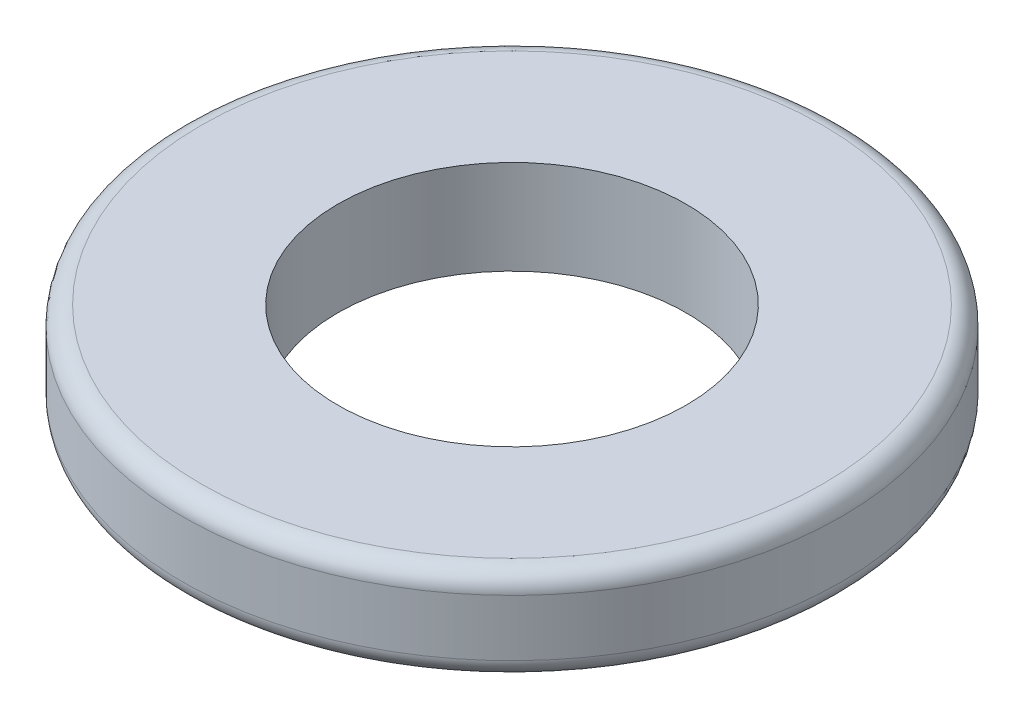
ISO-10303-21;
HEADER;
FILE_DESCRIPTION(('STEP AP214'),'2;1');
FILE_NAME('part.step','',(''),(''),'','','');
FILE_SCHEMA(('AUTOMOTIVE_DESIGN { 1 0 10303 214 1 1 1 1 }'));
ENDSEC;
DATA;
#1=APPLICATION_CONTEXT('core data for automotive mechanical design processes');
#2=APPLICATION_PROTOCOL_DEFINITION('international standard','automotive_design',2000,#1);
#3=PRODUCT_CONTEXT('',#1,'mechanical');
#4=PRODUCT('Part','Part','',(#3));
#5=PRODUCT_RELATED_PRODUCT_CATEGORY('part','',(#4));
#6=PRODUCT_DEFINITION_FORMATION('','',#4);
#7=PRODUCT_DEFINITION_CONTEXT('part definition',#1,'design');
#8=PRODUCT_DEFINITION('design','',#6,#7);
#9=PRODUCT_DEFINITION_SHAPE('','',#8);
#10=(LENGTH_UNIT() NAMED_UNIT(*) SI_UNIT(.MILLI.,.METRE.));
#11=(NAMED_UNIT(*) PLANE_ANGLE_UNIT() SI_UNIT($,.RADIAN.));
#12=(NAMED_UNIT(*) SI_UNIT($,.STERADIAN.) SOLID_ANGLE_UNIT());
#13=UNCERTAINTY_MEASURE_WITH_UNIT(LENGTH_MEASURE(1.E-05),#10,'distance_accuracy_value','');
#14=(GEOMETRIC_REPRESENTATION_CONTEXT(3) GLOBAL_UNCERTAINTY_ASSIGNED_CONTEXT((#13)) GLOBAL_UNIT_ASSIGNED_CONTEXT((#10,
#11,#12)) REPRESENTATION_CONTEXT('',''));
#15=CARTESIAN_POINT('',(0.,0.,0.));
#16=DIRECTION('',(0.,0.,1.));
#17=DIRECTION('',(1.,0.,0.));
#18=AXIS2_PLACEMENT_3D('',#15,#16,#17);
#19=CARTESIAN_POINT('',(-76.,-63.5440445445355,44.9));
#20=DIRECTION('',(0.,-1.,0.));
#21=DIRECTION('',(-1.,0.,0.));
#22=AXIS2_PLACEMENT_3D('',#19,#20,#21);
#23=TOROIDAL_SURFACE('',#22,3.3,0.2);
#24=CARTESIAN_POINT('',(-76.,-63.7440445445355,44.9));
#25=DIRECTION('',(0.,1.,0.));
#26=DIRECTION('',(-1.,0.,0.));
#27=AXIS2_PLACEMENT_3D('',#24,#25,#26);
#28=CIRCLE('',#27,3.3);
#29=CARTESIAN_POINT('',(-72.7,-63.7440445445355,44.9));
#30=VERTEX_POINT('',#29);
#31=CARTESIAN_POINT('',(-79.3,-63.7440445445355,44.9));
#32=VERTEX_POINT('',#31);
#33=EDGE_CURVE('E46',#30,#32,#28,.F.);
#34=ORIENTED_EDGE('',*,*,#33,.F.);
#35=CARTESIAN_POINT('',(-76.,-63.7440445445355,44.9));
#36=DIRECTION('',(0.,1.,0.));
#37=DIRECTION('',(1.,0.,0.));
#38=AXIS2_PLACEMENT_3D('',#35,#36,#37);
#39=CIRCLE('',#38,3.3);
#40=EDGE_CURVE('E49',#32,#30,#39,.F.);
#41=ORIENTED_EDGE('',*,*,#40,.F.);
#42=EDGE_LOOP('',(#34,#41));
#43=FACE_BOUND('',#42,.T.);
#44=CARTESIAN_POINT('',(-76.,-63.5440445445355,44.9));
#45=DIRECTION('',(0.,1.,0.));
#46=DIRECTION('',(-1.,0.,0.));
#47=AXIS2_PLACEMENT_3D('',#44,#45,#46);
#48=CIRCLE('',#47,3.5);
#49=CARTESIAN_POINT('',(-79.5,-63.5440445445355,44.9));
#50=VERTEX_POINT('',#49);
#51=EDGE_CURVE('E58',#50,#50,#48,.T.);
#52=ORIENTED_EDGE('',*,*,#51,.F.);
#53=EDGE_LOOP('',(#52));
#54=FACE_BOUND('',#53,.T.);
#55=ADVANCED_FACE('F18',(#43,#54),#23,.T.);
#56=CARTESIAN_POINT('',(-76.,-63.7440445445355,44.9));
#57=DIRECTION('',(0.,1.,0.));
#58=DIRECTION('',(-1.,0.,0.));
#59=AXIS2_PLACEMENT_3D('',#56,#57,#58);
#60=CYLINDRICAL_SURFACE('',#59,3.5);
#61=CARTESIAN_POINT('',(-76.,-62.9440445445355,44.9));
#62=DIRECTION('',(0.,-1.,0.));
#63=DIRECTION('',(-1.,0.,0.));
#64=AXIS2_PLACEMENT_3D('',#61,#62,#63);
#65=CIRCLE('',#64,3.5);
#66=CARTESIAN_POINT('',(-79.5,-62.9440445445355,44.9));
#67=VERTEX_POINT('',#66);
#68=EDGE_CURVE('E54',#67,#67,#65,.F.);
#69=ORIENTED_EDGE('',*,*,#68,.F.);
#70=EDGE_LOOP('',(#69));
#71=FACE_BOUND('',#70,.T.);
#72=ORIENTED_EDGE('',*,*,#51,.T.);
#73=EDGE_LOOP('',(#72));
#74=FACE_BOUND('',#73,.T.);
#75=ADVANCED_FACE('F129',(#71,#74),#60,.T.);
#76=CARTESIAN_POINT('',(-76.,-63.7440445445355,44.9));
#77=DIRECTION('',(0.,-1.,0.));
#78=DIRECTION('',(1.,0.,0.));
#79=AXIS2_PLACEMENT_3D('',#76,#77,#78);
#80=PLANE('',#79);
#81=CARTESIAN_POINT('',(-76.,-63.7440445445355,44.9));
#82=DIRECTION('',(0.,1.,0.));
#83=DIRECTION('',(-1.,0.,0.));
#84=AXIS2_PLACEMENT_3D('',#81,#82,#83);
#85=CIRCLE('',#84,1.85);
#86=CARTESIAN_POINT('',(-77.85,-63.7440445445355,44.9));
#87=VERTEX_POINT('',#86);
#88=EDGE_CURVE('E103',#87,#87,#85,.T.);
#89=ORIENTED_EDGE('',*,*,#88,.T.);
#90=EDGE_LOOP('',(#89));
#91=FACE_BOUND('',#90,.T.);
#92=ORIENTED_EDGE('',*,*,#33,.T.);
#93=ORIENTED_EDGE('',*,*,#40,.T.);
#94=EDGE_LOOP('',(#92,#93));
#95=FACE_BOUND('',#94,.T.);
#96=ADVANCED_FACE('F51',(#91,#95),#80,.T.);
#97=CARTESIAN_POINT('',(-76.,-62.9440445445355,44.9));
#98=DIRECTION('',(0.,-1.,0.));
#99=DIRECTION('',(-1.,0.,0.));
#100=AXIS2_PLACEMENT_3D('',#97,#98,#99);
#101=TOROIDAL_SURFACE('',#100,3.3,0.2);
#102=ORIENTED_EDGE('',*,*,#68,.T.);
#103=EDGE_LOOP('',(#102));
#104=FACE_BOUND('',#103,.T.);
#105=CARTESIAN_POINT('',(-76.,-62.7440445445355,44.9));
#106=DIRECTION('',(0.,-1.,0.));
#107=DIRECTION('',(-1.,0.,0.));
#108=AXIS2_PLACEMENT_3D('',#105,#106,#107);
#109=CIRCLE('',#108,3.3);
#110=CARTESIAN_POINT('',(-79.3,-62.7440445445355,44.9));
#111=VERTEX_POINT('',#110);
#112=CARTESIAN_POINT('',(-72.7,-62.7440445445355,44.9));
#113=VERTEX_POINT('',#112);
#114=EDGE_CURVE('E30',#111,#113,#109,.T.);
#115=ORIENTED_EDGE('',*,*,#114,.T.);
#116=CARTESIAN_POINT('',(-76.,-62.7440445445355,44.9));
#117=DIRECTION('',(0.,-1.,0.));
#118=DIRECTION('',(1.,0.,0.));
#119=AXIS2_PLACEMENT_3D('',#116,#117,#118);
#120=CIRCLE('',#119,3.3);
#121=EDGE_CURVE('E102',#113,#111,#120,.T.);
#122=ORIENTED_EDGE('',*,*,#121,.T.);
#123=EDGE_LOOP('',(#115,#122));
#124=FACE_BOUND('',#123,.T.);
#125=ADVANCED_FACE('F65',(#104,#124),#101,.T.);
#126=CARTESIAN_POINT('',(-76.,-63.7440445445355,44.9));
#127=DIRECTION('',(0.,1.,0.));
#128=DIRECTION('',(-1.,0.,0.));
#129=AXIS2_PLACEMENT_3D('',#126,#127,#128);
#130=CYLINDRICAL_SURFACE('',#129,1.85);
#131=ORIENTED_EDGE('',*,*,#88,.F.);
#132=EDGE_LOOP('',(#131));
#133=FACE_BOUND('',#132,.T.);
#134=CARTESIAN_POINT('',(-76.,-62.7440445445355,44.9));
#135=DIRECTION('',(0.,1.,0.));
#136=DIRECTION('',(-1.,0.,0.));
#137=AXIS2_PLACEMENT_3D('',#134,#135,#136);
#138=CIRCLE('',#137,1.85);
#139=CARTESIAN_POINT('',(-77.85,-62.7440445445355,44.9));
#140=VERTEX_POINT('',#139);
#141=EDGE_CURVE('E11',#140,#140,#138,.T.);
#142=ORIENTED_EDGE('',*,*,#141,.T.);
#143=EDGE_LOOP('',(#142));
#144=FACE_BOUND('',#143,.T.);
#145=ADVANCED_FACE('F76',(#133,#144),#130,.F.);
#146=CARTESIAN_POINT('',(-76.,-62.7440445445355,44.9));
#147=DIRECTION('',(0.,-1.,0.));
#148=DIRECTION('',(1.,0.,0.));
#149=AXIS2_PLACEMENT_3D('',#146,#147,#148);
#150=PLANE('',#149);
#151=ORIENTED_EDGE('',*,*,#141,.F.);
#152=EDGE_LOOP('',(#151));
#153=FACE_BOUND('',#152,.T.);
#154=ORIENTED_EDGE('',*,*,#121,.F.);
#155=ORIENTED_EDGE('',*,*,#114,.F.);
#156=EDGE_LOOP('',(#154,#155));
#157=FACE_BOUND('',#156,.T.);
#158=ADVANCED_FACE('F135',(#153,#157),#150,.F.);
#159=CLOSED_SHELL('',(#55,#75,#96,#125,#145,#158));
#160=MANIFOLD_SOLID_BREP('B1',#159);
#161=ADVANCED_BREP_SHAPE_REPRESENTATION('',(#18,#160),#14);
#162=SHAPE_DEFINITION_REPRESENTATION(#9,#161);
ENDSEC;
END-ISO-10303-21;
